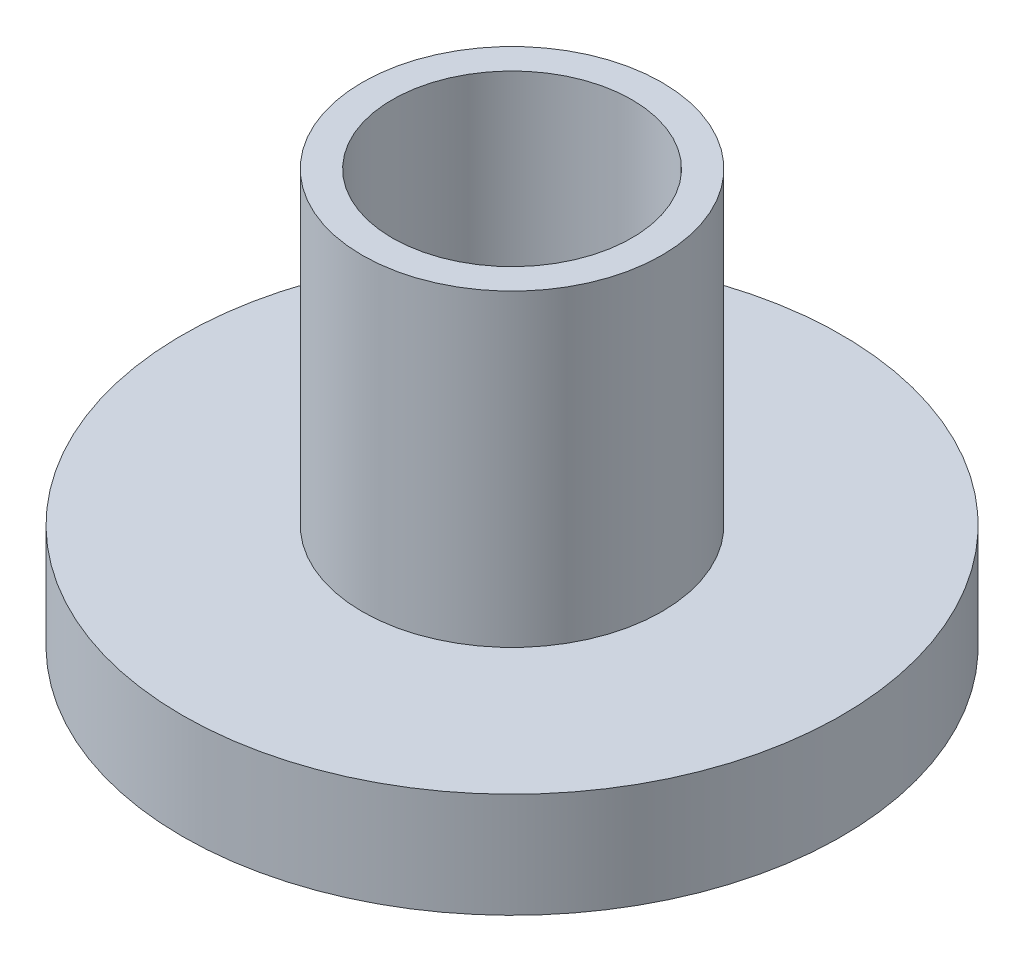
ISO-10303-21;
HEADER;
FILE_DESCRIPTION(('STEP AP214'),'2;1');
FILE_NAME('part.step','',(''),(''),'','','');
FILE_SCHEMA(('AUTOMOTIVE_DESIGN { 1 0 10303 214 1 1 1 1 }'));
ENDSEC;
DATA;
#1=APPLICATION_CONTEXT('core data for automotive mechanical design processes');
#2=APPLICATION_PROTOCOL_DEFINITION('international standard','automotive_design',2000,#1);
#3=PRODUCT_CONTEXT('',#1,'mechanical');
#4=PRODUCT('Part','Part','',(#3));
#5=PRODUCT_RELATED_PRODUCT_CATEGORY('part','',(#4));
#6=PRODUCT_DEFINITION_FORMATION('','',#4);
#7=PRODUCT_DEFINITION_CONTEXT('part definition',#1,'design');
#8=PRODUCT_DEFINITION('design','',#6,#7);
#9=PRODUCT_DEFINITION_SHAPE('','',#8);
#10=(LENGTH_UNIT() NAMED_UNIT(*) SI_UNIT(.MILLI.,.METRE.));
#11=(NAMED_UNIT(*) PLANE_ANGLE_UNIT() SI_UNIT($,.RADIAN.));
#12=(NAMED_UNIT(*) SI_UNIT($,.STERADIAN.) SOLID_ANGLE_UNIT());
#13=UNCERTAINTY_MEASURE_WITH_UNIT(LENGTH_MEASURE(1.E-05),#10,'distance_accuracy_value','');
#14=(GEOMETRIC_REPRESENTATION_CONTEXT(3) GLOBAL_UNCERTAINTY_ASSIGNED_CONTEXT((#13)) GLOBAL_UNIT_ASSIGNED_CONTEXT((#10,
#11,#12)) REPRESENTATION_CONTEXT('',''));
#15=CARTESIAN_POINT('',(0.,0.,0.));
#16=DIRECTION('',(0.,0.,1.));
#17=DIRECTION('',(1.,0.,0.));
#18=AXIS2_PLACEMENT_3D('',#15,#16,#17);
#19=CARTESIAN_POINT('',(0.,4.7,0.));
#20=DIRECTION('',(0.,1.,0.));
#21=DIRECTION('',(0.,0.,1.));
#22=AXIS2_PLACEMENT_3D('',#19,#20,#21);
#23=PLANE('',#22);
#24=CARTESIAN_POINT('',(0.,4.7,0.));
#25=DIRECTION('',(0.,1.,0.));
#26=DIRECTION('',(0.,0.,1.));
#27=AXIS2_PLACEMENT_3D('',#24,#25,#26);
#28=CIRCLE('',#27,11.);
#29=CARTESIAN_POINT('',(0.,4.7,11.));
#30=VERTEX_POINT('',#29);
#31=EDGE_CURVE('E43',#30,#30,#28,.T.);
#32=ORIENTED_EDGE('',*,*,#31,.T.);
#33=EDGE_LOOP('',(#32));
#34=FACE_BOUND('',#33,.T.);
#35=CARTESIAN_POINT('',(0.,4.7,0.));
#36=DIRECTION('',(0.,1.,0.));
#37=DIRECTION('',(0.,0.,1.));
#38=AXIS2_PLACEMENT_3D('',#35,#36,#37);
#39=CIRCLE('',#38,5.);
#40=CARTESIAN_POINT('',(0.,4.7,-5.));
#41=VERTEX_POINT('',#40);
#42=EDGE_CURVE('E51',#41,#41,#39,.T.);
#43=ORIENTED_EDGE('',*,*,#42,.F.);
#44=EDGE_LOOP('',(#43));
#45=FACE_BOUND('',#44,.T.);
#46=ADVANCED_FACE('F32',(#34,#45),#23,.T.);
#47=CARTESIAN_POINT('',(0.,1.2,0.));
#48=DIRECTION('',(0.,-1.,0.));
#49=DIRECTION('',(0.,0.,-1.));
#50=AXIS2_PLACEMENT_3D('',#47,#48,#49);
#51=CYLINDRICAL_SURFACE('',#50,5.);
#52=CARTESIAN_POINT('',(0.,1.2,0.));
#53=DIRECTION('',(0.,1.,0.));
#54=DIRECTION('',(0.,0.,1.));
#55=AXIS2_PLACEMENT_3D('',#52,#53,#54);
#56=CIRCLE('',#55,5.);
#57=CARTESIAN_POINT('',(0.,1.2,5.));
#58=VERTEX_POINT('',#57);
#59=EDGE_CURVE('E10',#58,#58,#56,.T.);
#60=ORIENTED_EDGE('',*,*,#59,.F.);
#61=EDGE_LOOP('',(#60));
#62=FACE_BOUND('',#61,.T.);
#63=CARTESIAN_POINT('',(0.,0.,0.));
#64=DIRECTION('',(0.,1.,0.));
#65=DIRECTION('',(0.,0.,1.));
#66=AXIS2_PLACEMENT_3D('',#63,#64,#65);
#67=CIRCLE('',#66,5.);
#68=CARTESIAN_POINT('',(0.,0.,5.));
#69=VERTEX_POINT('',#68);
#70=EDGE_CURVE('E36',#69,#69,#67,.T.);
#71=ORIENTED_EDGE('',*,*,#70,.T.);
#72=EDGE_LOOP('',(#71));
#73=FACE_BOUND('',#72,.T.);
#74=ADVANCED_FACE('F34',(#62,#73),#51,.T.);
#75=CARTESIAN_POINT('',(0.,0.,0.));
#76=DIRECTION('',(0.,1.,0.));
#77=DIRECTION('',(0.,0.,1.));
#78=AXIS2_PLACEMENT_3D('',#75,#76,#77);
#79=PLANE('',#78);
#80=CARTESIAN_POINT('',(0.,0.,0.));
#81=DIRECTION('',(0.,1.,0.));
#82=DIRECTION('',(0.,0.,1.));
#83=AXIS2_PLACEMENT_3D('',#80,#81,#82);
#84=CIRCLE('',#83,4.);
#85=CARTESIAN_POINT('',(0.,0.,4.));
#86=VERTEX_POINT('',#85);
#87=EDGE_CURVE('E54',#86,#86,#84,.T.);
#88=ORIENTED_EDGE('',*,*,#87,.T.);
#89=EDGE_LOOP('',(#88));
#90=FACE_BOUND('',#89,.T.);
#91=ORIENTED_EDGE('',*,*,#70,.F.);
#92=EDGE_LOOP('',(#91));
#93=FACE_BOUND('',#92,.T.);
#94=ADVANCED_FACE('F63',(#90,#93),#79,.F.);
#95=CARTESIAN_POINT('',(0.,1.2,0.));
#96=DIRECTION('',(0.,1.,0.));
#97=DIRECTION('',(0.,0.,1.));
#98=AXIS2_PLACEMENT_3D('',#95,#96,#97);
#99=PLANE('',#98);
#100=CARTESIAN_POINT('',(0.,1.2,0.));
#101=DIRECTION('',(0.,1.,0.));
#102=DIRECTION('',(0.,0.,1.));
#103=AXIS2_PLACEMENT_3D('',#100,#101,#102);
#104=CIRCLE('',#103,11.);
#105=CARTESIAN_POINT('',(0.,1.2,11.));
#106=VERTEX_POINT('',#105);
#107=EDGE_CURVE('E45',#106,#106,#104,.T.);
#108=ORIENTED_EDGE('',*,*,#107,.F.);
#109=EDGE_LOOP('',(#108));
#110=FACE_BOUND('',#109,.T.);
#111=ORIENTED_EDGE('',*,*,#59,.T.);
#112=EDGE_LOOP('',(#111));
#113=FACE_BOUND('',#112,.T.);
#114=ADVANCED_FACE('F93',(#110,#113),#99,.F.);
#115=CARTESIAN_POINT('',(0.,4.7,0.));
#116=DIRECTION('',(0.,-1.,0.));
#117=DIRECTION('',(0.,0.,-1.));
#118=AXIS2_PLACEMENT_3D('',#115,#116,#117);
#119=CYLINDRICAL_SURFACE('',#118,11.);
#120=ORIENTED_EDGE('',*,*,#31,.F.);
#121=EDGE_LOOP('',(#120));
#122=FACE_BOUND('',#121,.T.);
#123=ORIENTED_EDGE('',*,*,#107,.T.);
#124=EDGE_LOOP('',(#123));
#125=FACE_BOUND('',#124,.T.);
#126=ADVANCED_FACE('F81',(#122,#125),#119,.T.);
#127=CARTESIAN_POINT('',(0.,15.,0.));
#128=DIRECTION('',(0.,-1.,0.));
#129=DIRECTION('',(0.,0.,-1.));
#130=AXIS2_PLACEMENT_3D('',#127,#128,#129);
#131=CYLINDRICAL_SURFACE('',#130,5.);
#132=CARTESIAN_POINT('',(0.,15.,0.));
#133=DIRECTION('',(0.,1.,0.));
#134=DIRECTION('',(0.,0.,1.));
#135=AXIS2_PLACEMENT_3D('',#132,#133,#134);
#136=CIRCLE('',#135,5.);
#137=CARTESIAN_POINT('',(0.,15.,-5.));
#138=VERTEX_POINT('',#137);
#139=EDGE_CURVE('E48',#138,#138,#136,.T.);
#140=CARTESIAN_POINT('',(0.,15.,-5.));
#141=CARTESIAN_POINT('',(0.,14.8927083333333,-5.));
#142=CARTESIAN_POINT('',(0.,14.7854166666667,-5.));
#143=CARTESIAN_POINT('',(0.,14.5708333333333,-5.));
#144=CARTESIAN_POINT('',(0.,14.4635416666667,-5.));
#145=CARTESIAN_POINT('',(0.,14.2489583333333,-5.));
#146=CARTESIAN_POINT('',(0.,14.1416666666667,-5.));
#147=CARTESIAN_POINT('',(0.,13.9270833333333,-5.));
#148=CARTESIAN_POINT('',(0.,13.8197916666667,-5.));
#149=CARTESIAN_POINT('',(0.,13.6052083333333,-5.));
#150=CARTESIAN_POINT('',(0.,13.4979166666667,-5.));
#151=CARTESIAN_POINT('',(0.,13.2833333333333,-5.));
#152=CARTESIAN_POINT('',(0.,13.1760416666667,-5.));
#153=CARTESIAN_POINT('',(0.,12.9614583333333,-5.));
#154=CARTESIAN_POINT('',(0.,12.8541666666667,-5.));
#155=CARTESIAN_POINT('',(0.,12.6395833333333,-5.));
#156=CARTESIAN_POINT('',(0.,12.5322916666667,-5.));
#157=CARTESIAN_POINT('',(0.,12.3177083333333,-5.));
#158=CARTESIAN_POINT('',(0.,12.2104166666667,-5.));
#159=CARTESIAN_POINT('',(0.,11.9958333333333,-5.));
#160=CARTESIAN_POINT('',(0.,11.8885416666667,-5.));
#161=CARTESIAN_POINT('',(0.,11.6739583333333,-5.));
#162=CARTESIAN_POINT('',(0.,11.5666666666667,-5.));
#163=CARTESIAN_POINT('',(0.,11.3520833333333,-5.));
#164=CARTESIAN_POINT('',(0.,11.2447916666667,-5.));
#165=CARTESIAN_POINT('',(0.,11.0302083333333,-5.));
#166=CARTESIAN_POINT('',(0.,10.9229166666667,-5.));
#167=CARTESIAN_POINT('',(0.,10.7083333333333,-5.));
#168=CARTESIAN_POINT('',(0.,10.6010416666667,-5.));
#169=CARTESIAN_POINT('',(0.,10.3864583333333,-5.));
#170=CARTESIAN_POINT('',(0.,10.2791666666667,-5.));
#171=CARTESIAN_POINT('',(0.,10.0645833333333,-5.));
#172=CARTESIAN_POINT('',(0.,9.95729166666667,-5.));
#173=CARTESIAN_POINT('',(0.,9.74270833333333,-5.));
#174=CARTESIAN_POINT('',(0.,9.63541666666667,-5.));
#175=CARTESIAN_POINT('',(0.,9.42083333333333,-5.));
#176=CARTESIAN_POINT('',(0.,9.31354166666667,-5.));
#177=CARTESIAN_POINT('',(0.,9.09895833333333,-5.));
#178=CARTESIAN_POINT('',(0.,8.99166666666667,-5.));
#179=CARTESIAN_POINT('',(0.,8.77708333333333,-5.));
#180=CARTESIAN_POINT('',(0.,8.66979166666667,-5.));
#181=CARTESIAN_POINT('',(0.,8.45520833333333,-5.));
#182=CARTESIAN_POINT('',(0.,8.34791666666667,-5.));
#183=CARTESIAN_POINT('',(0.,8.13333333333333,-5.));
#184=CARTESIAN_POINT('',(0.,8.02604166666667,-5.));
#185=CARTESIAN_POINT('',(0.,7.81145833333333,-5.));
#186=CARTESIAN_POINT('',(0.,7.70416666666667,-5.));
#187=CARTESIAN_POINT('',(0.,7.48958333333333,-5.));
#188=CARTESIAN_POINT('',(0.,7.38229166666667,-5.));
#189=CARTESIAN_POINT('',(0.,7.16770833333333,-5.));
#190=CARTESIAN_POINT('',(0.,7.06041666666667,-5.));
#191=CARTESIAN_POINT('',(0.,6.84583333333333,-5.));
#192=CARTESIAN_POINT('',(0.,6.73854166666667,-5.));
#193=CARTESIAN_POINT('',(0.,6.52395833333333,-5.));
#194=CARTESIAN_POINT('',(0.,6.41666666666667,-5.));
#195=CARTESIAN_POINT('',(0.,6.20208333333333,-5.));
#196=CARTESIAN_POINT('',(0.,6.09479166666667,-5.));
#197=CARTESIAN_POINT('',(0.,5.88020833333333,-5.));
#198=CARTESIAN_POINT('',(0.,5.77291666666667,-5.));
#199=CARTESIAN_POINT('',(0.,5.55833333333333,-5.));
#200=CARTESIAN_POINT('',(0.,5.45104166666667,-5.));
#201=CARTESIAN_POINT('',(0.,5.23645833333333,-5.));
#202=CARTESIAN_POINT('',(0.,5.12916666666667,-5.));
#203=CARTESIAN_POINT('',(0.,4.91458333333333,-5.));
#204=CARTESIAN_POINT('',(0.,4.80729166666667,-5.));
#205=CARTESIAN_POINT('',(0.,4.7,-5.));
#206=B_SPLINE_CURVE_WITH_KNOTS('',3,(#140,#141,#142,#143,#144,#145,#146,#147,#148,#149,#150,
#151,#152,#153,#154,#155,#156,#157,#158,#159,#160,#161,#162,#163,#164,#165,#166,#167,#168,#169,
#170,#171,#172,#173,#174,#175,#176,#177,#178,#179,#180,#181,#182,#183,#184,#185,#186,#187,#188,
#189,#190,#191,#192,#193,#194,#195,#196,#197,#198,#199,#200,#201,#202,#203,#204,#205),
.UNSPECIFIED.,.F.,.F.,(4,2,2,2,2,2,2,2,2,2,2,2,2,2,2,2,2,2,2,2,2,2,2,2,2,2,2,2,2,2,2,2,4),(0.,
0.321874999999999,0.643749999999998,0.965625,1.2875,1.609375,1.93125,2.253125,2.575,2.896875,
3.21875,3.540625,3.8625,4.184375,4.50625,4.828125,5.15,5.471875,5.79375,6.115625,6.4375,
6.759375,7.08125,7.403125,7.725,8.046875,8.36875,8.690625,9.0125,9.334375,9.65625,9.978125,
10.3),.UNSPECIFIED.);
#207=EDGE_CURVE('BSEAM75',#138,#41,#206,.T.);
#208=ORIENTED_EDGE('',*,*,#139,.F.);
#209=ORIENTED_EDGE('',*,*,#42,.T.);
#210=ORIENTED_EDGE('',*,*,#207,.T.);
#211=ORIENTED_EDGE('',*,*,#207,.F.);
#212=EDGE_LOOP('',(#208,#210,#209,#211));
#213=FACE_BOUND('',#212,.T.);
#214=ADVANCED_FACE('F75',(#213),#131,.T.);
#215=CARTESIAN_POINT('',(0.,15.,0.));
#216=DIRECTION('',(0.,1.,0.));
#217=DIRECTION('',(0.,0.,1.));
#218=AXIS2_PLACEMENT_3D('',#215,#216,#217);
#219=PLANE('',#218);
#220=CARTESIAN_POINT('',(0.,15.,0.));
#221=DIRECTION('',(0.,1.,0.));
#222=DIRECTION('',(0.,0.,1.));
#223=AXIS2_PLACEMENT_3D('',#220,#221,#222);
#224=CIRCLE('',#223,4.);
#225=CARTESIAN_POINT('',(0.,15.,4.));
#226=VERTEX_POINT('',#225);
#227=EDGE_CURVE('E57',#226,#226,#224,.T.);
#228=ORIENTED_EDGE('',*,*,#227,.F.);
#229=EDGE_LOOP('',(#228));
#230=FACE_BOUND('',#229,.T.);
#231=ORIENTED_EDGE('',*,*,#139,.T.);
#232=EDGE_LOOP('',(#231));
#233=FACE_BOUND('',#232,.T.);
#234=ADVANCED_FACE('F69',(#230,#233),#219,.T.);
#235=CARTESIAN_POINT('',(0.,0.,0.));
#236=DIRECTION('',(0.,1.,0.));
#237=DIRECTION('',(0.,0.,1.));
#238=AXIS2_PLACEMENT_3D('',#235,#236,#237);
#239=CYLINDRICAL_SURFACE('',#238,4.);
#240=ORIENTED_EDGE('',*,*,#87,.F.);
#241=EDGE_LOOP('',(#240));
#242=FACE_BOUND('',#241,.T.);
#243=ORIENTED_EDGE('',*,*,#227,.T.);
#244=EDGE_LOOP('',(#243));
#245=FACE_BOUND('',#244,.T.);
#246=ADVANCED_FACE('F66',(#242,#245),#239,.F.);
#247=CLOSED_SHELL('',(#46,#74,#94,#114,#126,#214,#234,#246));
#248=MANIFOLD_SOLID_BREP('B2',#247);
#249=ADVANCED_BREP_SHAPE_REPRESENTATION('',(#18,#248),#14);
#250=SHAPE_DEFINITION_REPRESENTATION(#9,#249);
ENDSEC;
END-ISO-10303-21;
